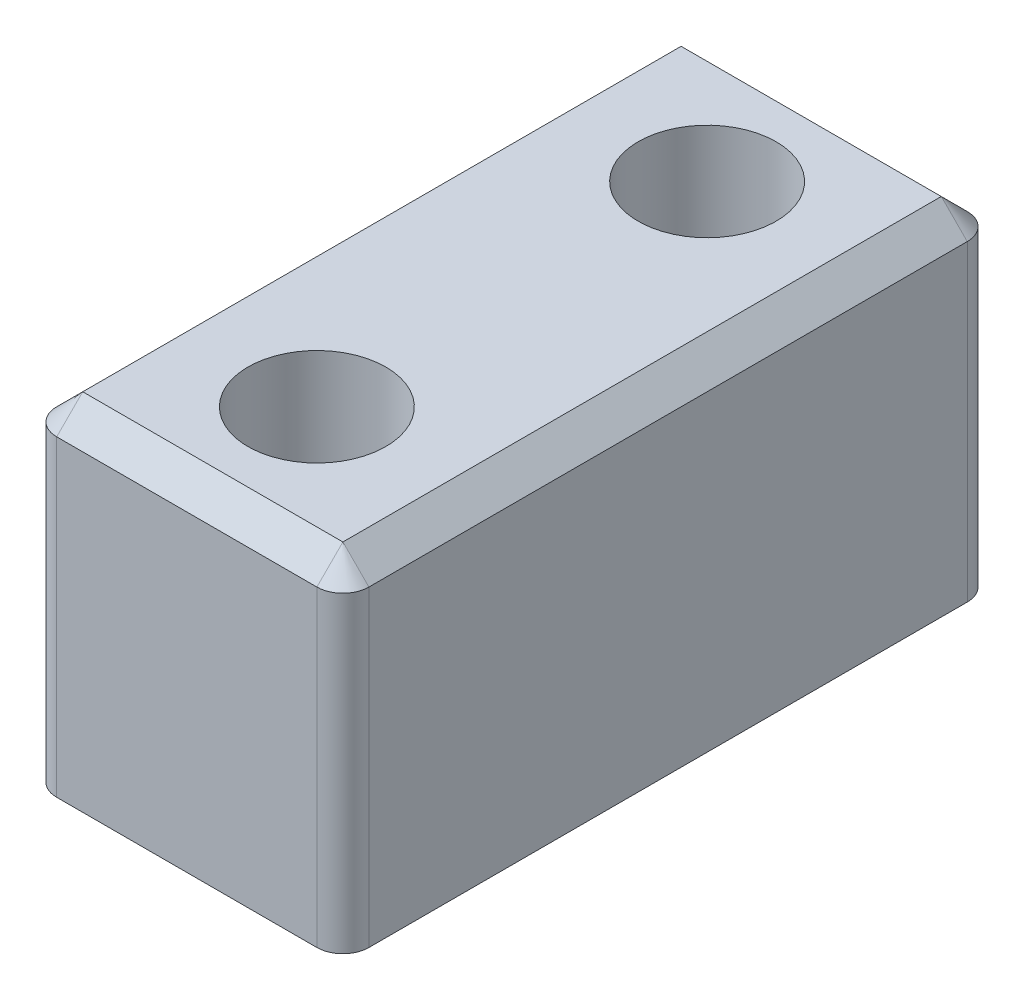
ISO-10303-21;
HEADER;
FILE_DESCRIPTION(('STEP AP214'),'2;1');
FILE_NAME('part.step','',(''),(''),'','','');
FILE_SCHEMA(('AUTOMOTIVE_DESIGN { 1 0 10303 214 1 1 1 1 }'));
ENDSEC;
DATA;
#1=APPLICATION_CONTEXT('core data for automotive mechanical design processes');
#2=APPLICATION_PROTOCOL_DEFINITION('international standard','automotive_design',2000,#1);
#3=PRODUCT_CONTEXT('',#1,'mechanical');
#4=PRODUCT('Part','Part','',(#3));
#5=PRODUCT_RELATED_PRODUCT_CATEGORY('part','',(#4));
#6=PRODUCT_DEFINITION_FORMATION('','',#4);
#7=PRODUCT_DEFINITION_CONTEXT('part definition',#1,'design');
#8=PRODUCT_DEFINITION('design','',#6,#7);
#9=PRODUCT_DEFINITION_SHAPE('','',#8);
#10=(LENGTH_UNIT() NAMED_UNIT(*) SI_UNIT(.MILLI.,.METRE.));
#11=(NAMED_UNIT(*) PLANE_ANGLE_UNIT() SI_UNIT($,.RADIAN.));
#12=(NAMED_UNIT(*) SI_UNIT($,.STERADIAN.) SOLID_ANGLE_UNIT());
#13=UNCERTAINTY_MEASURE_WITH_UNIT(LENGTH_MEASURE(1.E-05),#10,'distance_accuracy_value','');
#14=(GEOMETRIC_REPRESENTATION_CONTEXT(3) GLOBAL_UNCERTAINTY_ASSIGNED_CONTEXT((#13)) GLOBAL_UNIT_ASSIGNED_CONTEXT((#10,
#11,#12)) REPRESENTATION_CONTEXT('',''));
#15=CARTESIAN_POINT('',(0.,0.,0.));
#16=DIRECTION('',(0.,0.,1.));
#17=DIRECTION('',(1.,0.,0.));
#18=AXIS2_PLACEMENT_3D('',#15,#16,#17);
#19=CARTESIAN_POINT('',(0.,6.5,0.));
#20=DIRECTION('',(0.,1.,0.));
#21=DIRECTION('',(0.,0.,1.));
#22=AXIS2_PLACEMENT_3D('',#19,#20,#21);
#23=PLANE('',#22);
#24=DIRECTION('',(0.,0.,-1.));
#25=VECTOR('',#24,1.);
#26=CARTESIAN_POINT('',(5.,6.5,-11.5));
#27=LINE('',#26,#25);
#28=CARTESIAN_POINT('',(5.,6.5,11.5));
#29=VERTEX_POINT('',#28);
#30=CARTESIAN_POINT('',(5.,6.5,-11.5));
#31=VERTEX_POINT('',#30);
#32=EDGE_CURVE('E162',#29,#31,#27,.T.);
#33=ORIENTED_EDGE('',*,*,#32,.T.);
#34=DIRECTION('',(-1.,0.,0.));
#35=VECTOR('',#34,1.);
#36=CARTESIAN_POINT('',(-5.,6.5,-11.5));
#37=LINE('',#36,#35);
#38=CARTESIAN_POINT('',(-5.,6.5,-11.5));
#39=VERTEX_POINT('',#38);
#40=EDGE_CURVE('E166',#31,#39,#37,.T.);
#41=ORIENTED_EDGE('',*,*,#40,.T.);
#42=DIRECTION('',(0.,0.,1.));
#43=VECTOR('',#42,1.);
#44=CARTESIAN_POINT('',(-5.,6.5,11.5));
#45=LINE('',#44,#43);
#46=CARTESIAN_POINT('',(-5.,6.5,11.5));
#47=VERTEX_POINT('',#46);
#48=EDGE_CURVE('E164',#39,#47,#45,.T.);
#49=ORIENTED_EDGE('',*,*,#48,.T.);
#50=DIRECTION('',(1.,0.,0.));
#51=VECTOR('',#50,1.);
#52=CARTESIAN_POINT('',(5.,6.5,11.5));
#53=LINE('',#52,#51);
#54=EDGE_CURVE('E160',#47,#29,#53,.T.);
#55=ORIENTED_EDGE('',*,*,#54,.T.);
#56=EDGE_LOOP('',(#33,#41,#49,#55));
#57=FACE_BOUND('',#56,.T.);
#58=CARTESIAN_POINT('',(0.,6.5,-7.5));
#59=DIRECTION('',(0.,1.,0.));
#60=DIRECTION('',(0.,0.,1.));
#61=AXIS2_PLACEMENT_3D('',#58,#59,#60);
#62=CIRCLE('',#61,2.65);
#63=CARTESIAN_POINT('',(0.,6.5,-10.15));
#64=VERTEX_POINT('',#63);
#65=EDGE_CURVE('E217',#64,#64,#62,.T.);
#66=ORIENTED_EDGE('',*,*,#65,.F.);
#67=EDGE_LOOP('',(#66));
#68=FACE_BOUND('',#67,.T.);
#69=CARTESIAN_POINT('',(0.,6.5,7.5));
#70=DIRECTION('',(0.,1.,0.));
#71=DIRECTION('',(0.,0.,1.));
#72=AXIS2_PLACEMENT_3D('',#69,#70,#71);
#73=CIRCLE('',#72,2.65);
#74=CARTESIAN_POINT('',(0.,6.5,4.85));
#75=VERTEX_POINT('',#74);
#76=EDGE_CURVE('E209',#75,#75,#73,.T.);
#77=ORIENTED_EDGE('',*,*,#76,.F.);
#78=EDGE_LOOP('',(#77));
#79=FACE_BOUND('',#78,.T.);
#80=ADVANCED_FACE('F35',(#57,#68,#79),#23,.T.);
#81=CARTESIAN_POINT('',(0.,-6.5,0.));
#82=DIRECTION('',(0.,1.,0.));
#83=DIRECTION('',(0.,0.,1.));
#84=AXIS2_PLACEMENT_3D('',#81,#82,#83);
#85=PLANE('',#84);
#86=DIRECTION('',(1.,0.,0.));
#87=VECTOR('',#86,1.);
#88=CARTESIAN_POINT('',(-6.,-6.5,12.5));
#89=LINE('',#88,#87);
#90=CARTESIAN_POINT('',(-5.,-6.5,12.5));
#91=VERTEX_POINT('',#90);
#92=CARTESIAN_POINT('',(5.,-6.5,12.5));
#93=VERTEX_POINT('',#92);
#94=EDGE_CURVE('E116',#91,#93,#89,.T.);
#95=ORIENTED_EDGE('',*,*,#94,.F.);
#96=CARTESIAN_POINT('',(-5.,-6.5,11.5));
#97=DIRECTION('',(0.,1.,0.));
#98=DIRECTION('',(0.,0.,1.));
#99=AXIS2_PLACEMENT_3D('',#96,#97,#98);
#100=CIRCLE('',#99,1.);
#101=CARTESIAN_POINT('',(-6.,-6.5,11.5));
#102=VERTEX_POINT('',#101);
#103=EDGE_CURVE('E123',#91,#102,#100,.F.);
#104=ORIENTED_EDGE('',*,*,#103,.T.);
#105=DIRECTION('',(0.,0.,1.));
#106=VECTOR('',#105,1.);
#107=CARTESIAN_POINT('',(-6.,-6.5,-12.5));
#108=LINE('',#107,#106);
#109=CARTESIAN_POINT('',(-6.,-6.5,-11.5));
#110=VERTEX_POINT('',#109);
#111=EDGE_CURVE('E137',#110,#102,#108,.T.);
#112=ORIENTED_EDGE('',*,*,#111,.F.);
#113=CARTESIAN_POINT('',(-5.,-6.5,-11.5));
#114=DIRECTION('',(0.,1.,0.));
#115=DIRECTION('',(0.,0.,1.));
#116=AXIS2_PLACEMENT_3D('',#113,#114,#115);
#117=CIRCLE('',#116,1.);
#118=CARTESIAN_POINT('',(-5.,-6.5,-12.5));
#119=VERTEX_POINT('',#118);
#120=EDGE_CURVE('E131',#110,#119,#117,.F.);
#121=ORIENTED_EDGE('',*,*,#120,.T.);
#122=DIRECTION('',(-1.,0.,0.));
#123=VECTOR('',#122,1.);
#124=CARTESIAN_POINT('',(-6.,-6.5,-12.5));
#125=LINE('',#124,#123);
#126=CARTESIAN_POINT('',(5.,-6.5,-12.5));
#127=VERTEX_POINT('',#126);
#128=EDGE_CURVE('E140',#127,#119,#125,.T.);
#129=ORIENTED_EDGE('',*,*,#128,.F.);
#130=CARTESIAN_POINT('',(5.,-6.5,-11.5));
#131=DIRECTION('',(0.,1.,0.));
#132=DIRECTION('',(0.,0.,1.));
#133=AXIS2_PLACEMENT_3D('',#130,#131,#132);
#134=CIRCLE('',#133,1.);
#135=CARTESIAN_POINT('',(6.,-6.5,-11.5));
#136=VERTEX_POINT('',#135);
#137=EDGE_CURVE('E145',#127,#136,#134,.F.);
#138=ORIENTED_EDGE('',*,*,#137,.T.);
#139=DIRECTION('',(0.,0.,-1.));
#140=VECTOR('',#139,1.);
#141=CARTESIAN_POINT('',(6.,-6.5,-12.5));
#142=LINE('',#141,#140);
#143=CARTESIAN_POINT('',(6.,-6.5,11.5));
#144=VERTEX_POINT('',#143);
#145=EDGE_CURVE('E220',#144,#136,#142,.T.);
#146=ORIENTED_EDGE('',*,*,#145,.F.);
#147=CARTESIAN_POINT('',(5.,-6.5,11.5));
#148=DIRECTION('',(0.,1.,0.));
#149=DIRECTION('',(0.,0.,1.));
#150=AXIS2_PLACEMENT_3D('',#147,#148,#149);
#151=CIRCLE('',#150,1.);
#152=EDGE_CURVE('E119',#144,#93,#151,.F.);
#153=ORIENTED_EDGE('',*,*,#152,.T.);
#154=EDGE_LOOP('',(#95,#104,#112,#121,#129,#138,#146,#153));
#155=FACE_BOUND('',#154,.T.);
#156=CARTESIAN_POINT('',(0.,-6.5,-7.5));
#157=DIRECTION('',(0.,1.,0.));
#158=DIRECTION('',(0.,0.,1.));
#159=AXIS2_PLACEMENT_3D('',#156,#157,#158);
#160=CIRCLE('',#159,2.65);
#161=CARTESIAN_POINT('',(0.,-6.5,-10.15));
#162=VERTEX_POINT('',#161);
#163=EDGE_CURVE('E214',#162,#162,#160,.T.);
#164=ORIENTED_EDGE('',*,*,#163,.T.);
#165=EDGE_LOOP('',(#164));
#166=FACE_BOUND('',#165,.T.);
#167=CARTESIAN_POINT('',(0.,-6.5,7.5));
#168=DIRECTION('',(0.,1.,0.));
#169=DIRECTION('',(0.,0.,1.));
#170=AXIS2_PLACEMENT_3D('',#167,#168,#169);
#171=CIRCLE('',#170,2.65);
#172=CARTESIAN_POINT('',(0.,-6.5,4.85));
#173=VERTEX_POINT('',#172);
#174=EDGE_CURVE('E204',#173,#173,#171,.T.);
#175=ORIENTED_EDGE('',*,*,#174,.T.);
#176=EDGE_LOOP('',(#175));
#177=FACE_BOUND('',#176,.T.);
#178=ADVANCED_FACE('F133',(#155,#166,#177),#85,.F.);
#179=CARTESIAN_POINT('',(6.,6.5,-12.5));
#180=DIRECTION('',(-1.,0.,0.));
#181=DIRECTION('',(0.,0.,1.));
#182=AXIS2_PLACEMENT_3D('',#179,#180,#181);
#183=PLANE('',#182);
#184=DIRECTION('',(0.,-1.,0.));
#185=VECTOR('',#184,1.);
#186=CARTESIAN_POINT('',(6.,6.5,-11.5));
#187=LINE('',#186,#185);
#188=CARTESIAN_POINT('',(6.,5.5,-11.5));
#189=VERTEX_POINT('',#188);
#190=EDGE_CURVE('E157',#136,#189,#187,.F.);
#191=ORIENTED_EDGE('',*,*,#190,.T.);
#192=DIRECTION('',(0.,0.,1.));
#193=VECTOR('',#192,1.);
#194=CARTESIAN_POINT('',(6.,5.5,11.5));
#195=LINE('',#194,#193);
#196=CARTESIAN_POINT('',(6.,5.5,11.5));
#197=VERTEX_POINT('',#196);
#198=EDGE_CURVE('E178',#189,#197,#195,.T.);
#199=ORIENTED_EDGE('',*,*,#198,.T.);
#200=DIRECTION('',(0.,-1.,0.));
#201=VECTOR('',#200,1.);
#202=CARTESIAN_POINT('',(6.,6.5,11.5));
#203=LINE('',#202,#201);
#204=EDGE_CURVE('E155',#197,#144,#203,.T.);
#205=ORIENTED_EDGE('',*,*,#204,.T.);
#206=ORIENTED_EDGE('',*,*,#145,.T.);
#207=EDGE_LOOP('',(#191,#199,#205,#206));
#208=FACE_BOUND('',#207,.T.);
#209=ADVANCED_FACE('F251',(#208),#183,.F.);
#210=CARTESIAN_POINT('',(-6.,6.5,-12.5));
#211=DIRECTION('',(0.,0.,1.));
#212=DIRECTION('',(1.,0.,0.));
#213=AXIS2_PLACEMENT_3D('',#210,#211,#212);
#214=PLANE('',#213);
#215=DIRECTION('',(0.,-1.,0.));
#216=VECTOR('',#215,1.);
#217=CARTESIAN_POINT('',(-5.,6.5,-12.5));
#218=LINE('',#217,#216);
#219=CARTESIAN_POINT('',(-5.,5.5,-12.5));
#220=VERTEX_POINT('',#219);
#221=EDGE_CURVE('E152',#119,#220,#218,.F.);
#222=ORIENTED_EDGE('',*,*,#221,.T.);
#223=DIRECTION('',(1.,0.,0.));
#224=VECTOR('',#223,1.);
#225=CARTESIAN_POINT('',(5.,5.5,-12.5));
#226=LINE('',#225,#224);
#227=CARTESIAN_POINT('',(5.,5.5,-12.5));
#228=VERTEX_POINT('',#227);
#229=EDGE_CURVE('E169',#220,#228,#226,.T.);
#230=ORIENTED_EDGE('',*,*,#229,.T.);
#231=DIRECTION('',(0.,-1.,0.));
#232=VECTOR('',#231,1.);
#233=CARTESIAN_POINT('',(5.,6.5,-12.5));
#234=LINE('',#233,#232);
#235=EDGE_CURVE('E150',#228,#127,#234,.T.);
#236=ORIENTED_EDGE('',*,*,#235,.T.);
#237=ORIENTED_EDGE('',*,*,#128,.T.);
#238=EDGE_LOOP('',(#222,#230,#236,#237));
#239=FACE_BOUND('',#238,.T.);
#240=ADVANCED_FACE('F228',(#239),#214,.F.);
#241=CARTESIAN_POINT('',(-6.,6.5,-12.5));
#242=DIRECTION('',(1.,0.,0.));
#243=DIRECTION('',(0.,0.,-1.));
#244=AXIS2_PLACEMENT_3D('',#241,#242,#243);
#245=PLANE('',#244);
#246=DIRECTION('',(0.,-1.,0.));
#247=VECTOR('',#246,1.);
#248=CARTESIAN_POINT('',(-6.,6.5,11.5));
#249=LINE('',#248,#247);
#250=CARTESIAN_POINT('',(-6.,5.5,11.5));
#251=VERTEX_POINT('',#250);
#252=EDGE_CURVE('E126',#102,#251,#249,.F.);
#253=ORIENTED_EDGE('',*,*,#252,.T.);
#254=DIRECTION('',(0.,0.,-1.));
#255=VECTOR('',#254,1.);
#256=CARTESIAN_POINT('',(-6.,5.5,-11.5));
#257=LINE('',#256,#255);
#258=CARTESIAN_POINT('',(-6.,5.5,-11.5));
#259=VERTEX_POINT('',#258);
#260=EDGE_CURVE('E176',#251,#259,#257,.T.);
#261=ORIENTED_EDGE('',*,*,#260,.T.);
#262=DIRECTION('',(0.,-1.,0.));
#263=VECTOR('',#262,1.);
#264=CARTESIAN_POINT('',(-6.,6.5,-11.5));
#265=LINE('',#264,#263);
#266=EDGE_CURVE('E130',#259,#110,#265,.T.);
#267=ORIENTED_EDGE('',*,*,#266,.T.);
#268=ORIENTED_EDGE('',*,*,#111,.T.);
#269=EDGE_LOOP('',(#253,#261,#267,#268));
#270=FACE_BOUND('',#269,.T.);
#271=ADVANCED_FACE('F259',(#270),#245,.F.);
#272=CARTESIAN_POINT('',(-6.,6.5,12.5));
#273=DIRECTION('',(0.,0.,-1.));
#274=DIRECTION('',(-1.,0.,0.));
#275=AXIS2_PLACEMENT_3D('',#272,#273,#274);
#276=PLANE('',#275);
#277=DIRECTION('',(0.,-1.,0.));
#278=VECTOR('',#277,1.);
#279=CARTESIAN_POINT('',(5.,6.5,12.5));
#280=LINE('',#279,#278);
#281=CARTESIAN_POINT('',(5.,5.5,12.5));
#282=VERTEX_POINT('',#281);
#283=EDGE_CURVE('E120',#93,#282,#280,.F.);
#284=ORIENTED_EDGE('',*,*,#283,.T.);
#285=DIRECTION('',(-1.,0.,0.));
#286=VECTOR('',#285,1.);
#287=CARTESIAN_POINT('',(-5.,5.5,12.5));
#288=LINE('',#287,#286);
#289=CARTESIAN_POINT('',(-5.,5.5,12.5));
#290=VERTEX_POINT('',#289);
#291=EDGE_CURVE('E11',#282,#290,#288,.T.);
#292=ORIENTED_EDGE('',*,*,#291,.T.);
#293=DIRECTION('',(0.,-1.,0.));
#294=VECTOR('',#293,1.);
#295=CARTESIAN_POINT('',(-5.,6.5,12.5));
#296=LINE('',#295,#294);
#297=EDGE_CURVE('E112',#290,#91,#296,.T.);
#298=ORIENTED_EDGE('',*,*,#297,.T.);
#299=ORIENTED_EDGE('',*,*,#94,.T.);
#300=EDGE_LOOP('',(#284,#292,#298,#299));
#301=FACE_BOUND('',#300,.T.);
#302=ADVANCED_FACE('F114',(#301),#276,.F.);
#303=CARTESIAN_POINT('',(0.,6.5,-7.5));
#304=DIRECTION('',(0.,-1.,0.));
#305=DIRECTION('',(0.,0.,-1.));
#306=AXIS2_PLACEMENT_3D('',#303,#304,#305);
#307=CYLINDRICAL_SURFACE('',#306,2.65);
#308=CARTESIAN_POINT('',(0.,6.5,-10.15));
#309=CARTESIAN_POINT('',(0.,6.36458333333333,-10.15));
#310=CARTESIAN_POINT('',(0.,6.22916666666667,-10.15));
#311=CARTESIAN_POINT('',(0.,5.95833333333333,-10.15));
#312=CARTESIAN_POINT('',(0.,5.82291666666667,-10.15));
#313=CARTESIAN_POINT('',(0.,5.55208333333333,-10.15));
#314=CARTESIAN_POINT('',(0.,5.41666666666667,-10.15));
#315=CARTESIAN_POINT('',(0.,5.14583333333333,-10.15));
#316=CARTESIAN_POINT('',(0.,5.01041666666667,-10.15));
#317=CARTESIAN_POINT('',(0.,4.73958333333333,-10.15));
#318=CARTESIAN_POINT('',(0.,4.60416666666667,-10.15));
#319=CARTESIAN_POINT('',(0.,4.33333333333333,-10.15));
#320=CARTESIAN_POINT('',(0.,4.19791666666667,-10.15));
#321=CARTESIAN_POINT('',(0.,3.92708333333333,-10.15));
#322=CARTESIAN_POINT('',(0.,3.79166666666667,-10.15));
#323=CARTESIAN_POINT('',(0.,3.52083333333333,-10.15));
#324=CARTESIAN_POINT('',(0.,3.38541666666667,-10.15));
#325=CARTESIAN_POINT('',(0.,3.11458333333333,-10.15));
#326=CARTESIAN_POINT('',(0.,2.97916666666667,-10.15));
#327=CARTESIAN_POINT('',(0.,2.70833333333333,-10.15));
#328=CARTESIAN_POINT('',(0.,2.57291666666667,-10.15));
#329=CARTESIAN_POINT('',(0.,2.30208333333333,-10.15));
#330=CARTESIAN_POINT('',(0.,2.16666666666667,-10.15));
#331=CARTESIAN_POINT('',(0.,1.89583333333333,-10.15));
#332=CARTESIAN_POINT('',(0.,1.76041666666667,-10.15));
#333=CARTESIAN_POINT('',(0.,1.48958333333333,-10.15));
#334=CARTESIAN_POINT('',(0.,1.35416666666667,-10.15));
#335=CARTESIAN_POINT('',(0.,1.08333333333333,-10.15));
#336=CARTESIAN_POINT('',(0.,0.947916666666666,-10.15));
#337=CARTESIAN_POINT('',(0.,0.677083333333332,-10.15));
#338=CARTESIAN_POINT('',(0.,0.541666666666666,-10.15));
#339=CARTESIAN_POINT('',(0.,0.270833333333333,-10.15));
#340=CARTESIAN_POINT('',(0.,0.135416666666666,-10.15));
#341=CARTESIAN_POINT('',(0.,-0.135416666666668,-10.15));
#342=CARTESIAN_POINT('',(0.,-0.270833333333334,-10.15));
#343=CARTESIAN_POINT('',(0.,-0.541666666666668,-10.15));
#344=CARTESIAN_POINT('',(0.,-0.677083333333334,-10.15));
#345=CARTESIAN_POINT('',(0.,-0.947916666666667,-10.15));
#346=CARTESIAN_POINT('',(0.,-1.08333333333333,-10.15));
#347=CARTESIAN_POINT('',(0.,-1.35416666666667,-10.15));
#348=CARTESIAN_POINT('',(0.,-1.48958333333333,-10.15));
#349=CARTESIAN_POINT('',(0.,-1.76041666666667,-10.15));
#350=CARTESIAN_POINT('',(0.,-1.89583333333333,-10.15));
#351=CARTESIAN_POINT('',(0.,-2.16666666666667,-10.15));
#352=CARTESIAN_POINT('',(0.,-2.30208333333333,-10.15));
#353=CARTESIAN_POINT('',(0.,-2.57291666666667,-10.15));
#354=CARTESIAN_POINT('',(0.,-2.70833333333333,-10.15));
#355=CARTESIAN_POINT('',(0.,-2.97916666666667,-10.15));
#356=CARTESIAN_POINT('',(0.,-3.11458333333333,-10.15));
#357=CARTESIAN_POINT('',(0.,-3.38541666666667,-10.15));
#358=CARTESIAN_POINT('',(0.,-3.52083333333333,-10.15));
#359=CARTESIAN_POINT('',(0.,-3.79166666666667,-10.15));
#360=CARTESIAN_POINT('',(0.,-3.92708333333333,-10.15));
#361=CARTESIAN_POINT('',(0.,-4.19791666666667,-10.15));
#362=CARTESIAN_POINT('',(0.,-4.33333333333333,-10.15));
#363=CARTESIAN_POINT('',(0.,-4.60416666666667,-10.15));
#364=CARTESIAN_POINT('',(0.,-4.73958333333333,-10.15));
#365=CARTESIAN_POINT('',(0.,-5.01041666666667,-10.15));
#366=CARTESIAN_POINT('',(0.,-5.14583333333333,-10.15));
#367=CARTESIAN_POINT('',(0.,-5.41666666666667,-10.15));
#368=CARTESIAN_POINT('',(0.,-5.55208333333333,-10.15));
#369=CARTESIAN_POINT('',(0.,-5.82291666666667,-10.15));
#370=CARTESIAN_POINT('',(0.,-5.95833333333333,-10.15));
#371=CARTESIAN_POINT('',(0.,-6.22916666666667,-10.15));
#372=CARTESIAN_POINT('',(0.,-6.36458333333333,-10.15));
#373=CARTESIAN_POINT('',(0.,-6.5,-10.15));
#374=B_SPLINE_CURVE_WITH_KNOTS('',3,(#308,#309,#310,#311,#312,#313,#314,#315,#316,#317,#318,
#319,#320,#321,#322,#323,#324,#325,#326,#327,#328,#329,#330,#331,#332,#333,#334,#335,#336,#337,
#338,#339,#340,#341,#342,#343,#344,#345,#346,#347,#348,#349,#350,#351,#352,#353,#354,#355,#356,
#357,#358,#359,#360,#361,#362,#363,#364,#365,#366,#367,#368,#369,#370,#371,#372,#373),
.UNSPECIFIED.,.F.,.F.,(4,2,2,2,2,2,2,2,2,2,2,2,2,2,2,2,2,2,2,2,2,2,2,2,2,2,2,2,2,2,2,2,4),(0.,
0.40625,0.8125,1.21875,1.625,2.03125,2.4375,2.84375,3.25,3.65625,4.0625,4.46875,4.875,5.28125,
5.6875,6.09375,6.5,6.90625,7.3125,7.71875,8.125,8.53125,8.9375,9.34375,9.75,10.15625,10.5625,
10.96875,11.375,11.78125,12.1875,12.59375,13.),.UNSPECIFIED.);
#375=EDGE_CURVE('BSEAM286',#64,#162,#374,.T.);
#376=ORIENTED_EDGE('',*,*,#65,.T.);
#377=ORIENTED_EDGE('',*,*,#163,.F.);
#378=ORIENTED_EDGE('',*,*,#375,.T.);
#379=ORIENTED_EDGE('',*,*,#375,.F.);
#380=EDGE_LOOP('',(#376,#378,#377,#379));
#381=FACE_BOUND('',#380,.T.);
#382=ADVANCED_FACE('F286',(#381),#307,.F.);
#383=CARTESIAN_POINT('',(0.,6.5,7.5));
#384=DIRECTION('',(0.,-1.,0.));
#385=DIRECTION('',(0.,0.,-1.));
#386=AXIS2_PLACEMENT_3D('',#383,#384,#385);
#387=CYLINDRICAL_SURFACE('',#386,2.65);
#388=CARTESIAN_POINT('',(0.,6.5,4.85));
#389=CARTESIAN_POINT('',(0.,6.36458333333333,4.85));
#390=CARTESIAN_POINT('',(0.,6.22916666666667,4.85));
#391=CARTESIAN_POINT('',(0.,5.95833333333333,4.85));
#392=CARTESIAN_POINT('',(0.,5.82291666666667,4.85));
#393=CARTESIAN_POINT('',(0.,5.55208333333333,4.85));
#394=CARTESIAN_POINT('',(0.,5.41666666666667,4.85));
#395=CARTESIAN_POINT('',(0.,5.14583333333333,4.85));
#396=CARTESIAN_POINT('',(0.,5.01041666666667,4.85));
#397=CARTESIAN_POINT('',(0.,4.73958333333333,4.85));
#398=CARTESIAN_POINT('',(0.,4.60416666666667,4.85));
#399=CARTESIAN_POINT('',(0.,4.33333333333333,4.85));
#400=CARTESIAN_POINT('',(0.,4.19791666666667,4.85));
#401=CARTESIAN_POINT('',(0.,3.92708333333333,4.85));
#402=CARTESIAN_POINT('',(0.,3.79166666666667,4.85));
#403=CARTESIAN_POINT('',(0.,3.52083333333333,4.85));
#404=CARTESIAN_POINT('',(0.,3.38541666666667,4.85));
#405=CARTESIAN_POINT('',(0.,3.11458333333333,4.85));
#406=CARTESIAN_POINT('',(0.,2.97916666666667,4.85));
#407=CARTESIAN_POINT('',(0.,2.70833333333333,4.85));
#408=CARTESIAN_POINT('',(0.,2.57291666666667,4.85));
#409=CARTESIAN_POINT('',(0.,2.30208333333333,4.85));
#410=CARTESIAN_POINT('',(0.,2.16666666666667,4.85));
#411=CARTESIAN_POINT('',(0.,1.89583333333333,4.85));
#412=CARTESIAN_POINT('',(0.,1.76041666666667,4.85));
#413=CARTESIAN_POINT('',(0.,1.48958333333333,4.85));
#414=CARTESIAN_POINT('',(0.,1.35416666666667,4.85));
#415=CARTESIAN_POINT('',(0.,1.08333333333333,4.85));
#416=CARTESIAN_POINT('',(0.,0.947916666666666,4.85));
#417=CARTESIAN_POINT('',(0.,0.677083333333332,4.85));
#418=CARTESIAN_POINT('',(0.,0.541666666666666,4.85));
#419=CARTESIAN_POINT('',(0.,0.270833333333333,4.85));
#420=CARTESIAN_POINT('',(0.,0.135416666666666,4.85));
#421=CARTESIAN_POINT('',(0.,-0.135416666666668,4.85));
#422=CARTESIAN_POINT('',(0.,-0.270833333333334,4.85));
#423=CARTESIAN_POINT('',(0.,-0.541666666666668,4.85));
#424=CARTESIAN_POINT('',(0.,-0.677083333333334,4.85));
#425=CARTESIAN_POINT('',(0.,-0.947916666666667,4.85));
#426=CARTESIAN_POINT('',(0.,-1.08333333333333,4.85));
#427=CARTESIAN_POINT('',(0.,-1.35416666666667,4.85));
#428=CARTESIAN_POINT('',(0.,-1.48958333333333,4.85));
#429=CARTESIAN_POINT('',(0.,-1.76041666666667,4.85));
#430=CARTESIAN_POINT('',(0.,-1.89583333333333,4.85));
#431=CARTESIAN_POINT('',(0.,-2.16666666666667,4.85));
#432=CARTESIAN_POINT('',(0.,-2.30208333333333,4.85));
#433=CARTESIAN_POINT('',(0.,-2.57291666666667,4.85));
#434=CARTESIAN_POINT('',(0.,-2.70833333333333,4.85));
#435=CARTESIAN_POINT('',(0.,-2.97916666666667,4.85));
#436=CARTESIAN_POINT('',(0.,-3.11458333333333,4.85));
#437=CARTESIAN_POINT('',(0.,-3.38541666666667,4.85));
#438=CARTESIAN_POINT('',(0.,-3.52083333333333,4.85));
#439=CARTESIAN_POINT('',(0.,-3.79166666666667,4.85));
#440=CARTESIAN_POINT('',(0.,-3.92708333333333,4.85));
#441=CARTESIAN_POINT('',(0.,-4.19791666666667,4.85));
#442=CARTESIAN_POINT('',(0.,-4.33333333333333,4.85));
#443=CARTESIAN_POINT('',(0.,-4.60416666666667,4.85));
#444=CARTESIAN_POINT('',(0.,-4.73958333333333,4.85));
#445=CARTESIAN_POINT('',(0.,-5.01041666666667,4.85));
#446=CARTESIAN_POINT('',(0.,-5.14583333333333,4.85));
#447=CARTESIAN_POINT('',(0.,-5.41666666666667,4.85));
#448=CARTESIAN_POINT('',(0.,-5.55208333333333,4.85));
#449=CARTESIAN_POINT('',(0.,-5.82291666666667,4.85));
#450=CARTESIAN_POINT('',(0.,-5.95833333333333,4.85));
#451=CARTESIAN_POINT('',(0.,-6.22916666666667,4.85));
#452=CARTESIAN_POINT('',(0.,-6.36458333333333,4.85));
#453=CARTESIAN_POINT('',(0.,-6.5,4.85));
#454=B_SPLINE_CURVE_WITH_KNOTS('',3,(#388,#389,#390,#391,#392,#393,#394,#395,#396,#397,#398,
#399,#400,#401,#402,#403,#404,#405,#406,#407,#408,#409,#410,#411,#412,#413,#414,#415,#416,#417,
#418,#419,#420,#421,#422,#423,#424,#425,#426,#427,#428,#429,#430,#431,#432,#433,#434,#435,#436,
#437,#438,#439,#440,#441,#442,#443,#444,#445,#446,#447,#448,#449,#450,#451,#452,#453),
.UNSPECIFIED.,.F.,.F.,(4,2,2,2,2,2,2,2,2,2,2,2,2,2,2,2,2,2,2,2,2,2,2,2,2,2,2,2,2,2,2,2,4),(0.,
0.40625,0.8125,1.21875,1.625,2.03125,2.4375,2.84375,3.25,3.65625,4.0625,4.46875,4.875,5.28125,
5.6875,6.09375,6.5,6.90625,7.3125,7.71875,8.125,8.53125,8.9375,9.34375,9.75,10.15625,10.5625,
10.96875,11.375,11.78125,12.1875,12.59375,13.),.UNSPECIFIED.);
#455=EDGE_CURVE('BSEAM299',#75,#173,#454,.T.);
#456=ORIENTED_EDGE('',*,*,#76,.T.);
#457=ORIENTED_EDGE('',*,*,#174,.F.);
#458=ORIENTED_EDGE('',*,*,#455,.T.);
#459=ORIENTED_EDGE('',*,*,#455,.F.);
#460=EDGE_LOOP('',(#456,#458,#457,#459));
#461=FACE_BOUND('',#460,.T.);
#462=ADVANCED_FACE('F299',(#461),#387,.F.);
#463=CARTESIAN_POINT('',(-5.,6.5,11.5));
#464=DIRECTION('',(0.,-1.,0.));
#465=DIRECTION('',(0.,0.,-1.));
#466=AXIS2_PLACEMENT_3D('',#463,#464,#465);
#467=CYLINDRICAL_SURFACE('',#466,1.);
#468=ORIENTED_EDGE('',*,*,#297,.F.);
#469=CARTESIAN_POINT('',(-5.,5.5,11.5));
#470=DIRECTION('',(0.,1.,0.));
#471=DIRECTION('',(0.,0.,1.));
#472=AXIS2_PLACEMENT_3D('',#469,#470,#471);
#473=CIRCLE('',#472,1.);
#474=EDGE_CURVE('E180',#290,#251,#473,.F.);
#475=ORIENTED_EDGE('',*,*,#474,.T.);
#476=ORIENTED_EDGE('',*,*,#252,.F.);
#477=ORIENTED_EDGE('',*,*,#103,.F.);
#478=EDGE_LOOP('',(#468,#475,#476,#477));
#479=FACE_BOUND('',#478,.T.);
#480=ADVANCED_FACE('F124',(#479),#467,.T.);
#481=CARTESIAN_POINT('',(-5.,6.5,-11.5));
#482=DIRECTION('',(0.,-1.,0.));
#483=DIRECTION('',(0.,0.,-1.));
#484=AXIS2_PLACEMENT_3D('',#481,#482,#483);
#485=CYLINDRICAL_SURFACE('',#484,1.);
#486=ORIENTED_EDGE('',*,*,#266,.F.);
#487=CARTESIAN_POINT('',(-5.,5.5,-11.5));
#488=DIRECTION('',(0.,1.,0.));
#489=DIRECTION('',(0.,0.,1.));
#490=AXIS2_PLACEMENT_3D('',#487,#488,#489);
#491=CIRCLE('',#490,1.);
#492=EDGE_CURVE('E172',#259,#220,#491,.F.);
#493=ORIENTED_EDGE('',*,*,#492,.T.);
#494=ORIENTED_EDGE('',*,*,#221,.F.);
#495=ORIENTED_EDGE('',*,*,#120,.F.);
#496=EDGE_LOOP('',(#486,#493,#494,#495));
#497=FACE_BOUND('',#496,.T.);
#498=ADVANCED_FACE('F235',(#497),#485,.T.);
#499=CARTESIAN_POINT('',(5.,6.5,-11.5));
#500=DIRECTION('',(0.,-1.,0.));
#501=DIRECTION('',(0.,0.,-1.));
#502=AXIS2_PLACEMENT_3D('',#499,#500,#501);
#503=CYLINDRICAL_SURFACE('',#502,1.);
#504=ORIENTED_EDGE('',*,*,#235,.F.);
#505=CARTESIAN_POINT('',(5.,5.5,-11.5));
#506=DIRECTION('',(0.,1.,0.));
#507=DIRECTION('',(0.,0.,1.));
#508=AXIS2_PLACEMENT_3D('',#505,#506,#507);
#509=CIRCLE('',#508,1.);
#510=EDGE_CURVE('E174',#228,#189,#509,.F.);
#511=ORIENTED_EDGE('',*,*,#510,.T.);
#512=ORIENTED_EDGE('',*,*,#190,.F.);
#513=ORIENTED_EDGE('',*,*,#137,.F.);
#514=EDGE_LOOP('',(#504,#511,#512,#513));
#515=FACE_BOUND('',#514,.T.);
#516=ADVANCED_FACE('F248',(#515),#503,.T.);
#517=CARTESIAN_POINT('',(5.,6.5,11.5));
#518=DIRECTION('',(0.,-1.,0.));
#519=DIRECTION('',(0.,0.,-1.));
#520=AXIS2_PLACEMENT_3D('',#517,#518,#519);
#521=CYLINDRICAL_SURFACE('',#520,1.);
#522=ORIENTED_EDGE('',*,*,#204,.F.);
#523=CARTESIAN_POINT('',(5.,5.5,11.5));
#524=DIRECTION('',(0.,1.,0.));
#525=DIRECTION('',(0.,0.,1.));
#526=AXIS2_PLACEMENT_3D('',#523,#524,#525);
#527=CIRCLE('',#526,1.);
#528=EDGE_CURVE('E45',#197,#282,#527,.F.);
#529=ORIENTED_EDGE('',*,*,#528,.T.);
#530=ORIENTED_EDGE('',*,*,#283,.F.);
#531=ORIENTED_EDGE('',*,*,#152,.F.);
#532=EDGE_LOOP('',(#522,#529,#530,#531));
#533=FACE_BOUND('',#532,.T.);
#534=ADVANCED_FACE('F253',(#533),#521,.T.);
#535=CARTESIAN_POINT('',(0.,6.5,11.5));
#536=DIRECTION('',(0.,0.707106781186546,0.707106781186549));
#537=DIRECTION('',(-1.,0.,0.));
#538=AXIS2_PLACEMENT_3D('',#535,#536,#537);
#539=PLANE('',#538);
#540=DIRECTION('',(0.,0.707106781186549,-0.707106781186546));
#541=VECTOR('',#540,1.);
#542=CARTESIAN_POINT('',(-5.,5.5,12.5));
#543=LINE('',#542,#541);
#544=EDGE_CURVE('E198',#290,#47,#543,.T.);
#545=ORIENTED_EDGE('',*,*,#544,.F.);
#546=ORIENTED_EDGE('',*,*,#291,.F.);
#547=DIRECTION('',(0.,-0.707106781186549,0.707106781186546));
#548=VECTOR('',#547,1.);
#549=CARTESIAN_POINT('',(5.,6.5,11.5));
#550=LINE('',#549,#548);
#551=EDGE_CURVE('E40',#29,#282,#550,.T.);
#552=ORIENTED_EDGE('',*,*,#551,.F.);
#553=ORIENTED_EDGE('',*,*,#54,.F.);
#554=EDGE_LOOP('',(#545,#546,#552,#553));
#555=FACE_BOUND('',#554,.T.);
#556=ADVANCED_FACE('F38',(#555),#539,.T.);
#557=CARTESIAN_POINT('',(5.,5.5,11.5));
#558=DIRECTION('',(0.,-1.,0.));
#559=DIRECTION('',(0.,0.,-1.));
#560=AXIS2_PLACEMENT_3D('',#557,#558,#559);
#561=CONICAL_SURFACE('',#560,0.999999999999997,0.785398163397447);
#562=ORIENTED_EDGE('',*,*,#551,.T.);
#563=ORIENTED_EDGE('',*,*,#528,.F.);
#564=DIRECTION('',(0.707106781186546,-0.707106781186549,0.));
#565=VECTOR('',#564,1.);
#566=CARTESIAN_POINT('',(5.,6.5,11.5));
#567=LINE('',#566,#565);
#568=EDGE_CURVE('E196',#29,#197,#567,.T.);
#569=ORIENTED_EDGE('',*,*,#568,.F.);
#570=EDGE_LOOP('',(#562,#563,#569));
#571=FACE_BOUND('',#570,.T.);
#572=ADVANCED_FACE('F329',(#571),#561,.T.);
#573=CARTESIAN_POINT('',(-5.,5.5,11.5));
#574=DIRECTION('',(0.,-1.,0.));
#575=DIRECTION('',(0.,0.,-1.));
#576=AXIS2_PLACEMENT_3D('',#573,#574,#575);
#577=CONICAL_SURFACE('',#576,0.999999999999997,0.785398163397447);
#578=ORIENTED_EDGE('',*,*,#474,.F.);
#579=ORIENTED_EDGE('',*,*,#544,.T.);
#580=DIRECTION('',(0.707106781186547,0.707106781186548,0.));
#581=VECTOR('',#580,1.);
#582=CARTESIAN_POINT('',(-6.,5.5,11.5));
#583=LINE('',#582,#581);
#584=EDGE_CURVE('E193',#251,#47,#583,.T.);
#585=ORIENTED_EDGE('',*,*,#584,.F.);
#586=EDGE_LOOP('',(#578,#579,#585));
#587=FACE_BOUND('',#586,.T.);
#588=ADVANCED_FACE('F256',(#587),#577,.T.);
#589=CARTESIAN_POINT('',(5.,6.5,0.));
#590=DIRECTION('',(0.707106781186549,0.707106781186546,0.));
#591=DIRECTION('',(0.,0.,1.));
#592=AXIS2_PLACEMENT_3D('',#589,#590,#591);
#593=PLANE('',#592);
#594=ORIENTED_EDGE('',*,*,#568,.T.);
#595=ORIENTED_EDGE('',*,*,#198,.F.);
#596=DIRECTION('',(0.707106781186546,-0.707106781186549,0.));
#597=VECTOR('',#596,1.);
#598=CARTESIAN_POINT('',(5.,6.5,-11.5));
#599=LINE('',#598,#597);
#600=EDGE_CURVE('E190',#31,#189,#599,.T.);
#601=ORIENTED_EDGE('',*,*,#600,.F.);
#602=ORIENTED_EDGE('',*,*,#32,.F.);
#603=EDGE_LOOP('',(#594,#595,#601,#602));
#604=FACE_BOUND('',#603,.T.);
#605=ADVANCED_FACE('F267',(#604),#593,.T.);
#606=CARTESIAN_POINT('',(-5.,6.5,0.));
#607=DIRECTION('',(-0.707106781186549,0.707106781186546,0.));
#608=DIRECTION('',(0.,0.,-1.));
#609=AXIS2_PLACEMENT_3D('',#606,#607,#608);
#610=PLANE('',#609);
#611=ORIENTED_EDGE('',*,*,#584,.T.);
#612=ORIENTED_EDGE('',*,*,#48,.F.);
#613=DIRECTION('',(0.707106781186546,0.707106781186549,0.));
#614=VECTOR('',#613,1.);
#615=CARTESIAN_POINT('',(-6.,5.5,-11.5));
#616=LINE('',#615,#614);
#617=EDGE_CURVE('E187',#259,#39,#616,.T.);
#618=ORIENTED_EDGE('',*,*,#617,.F.);
#619=ORIENTED_EDGE('',*,*,#260,.F.);
#620=EDGE_LOOP('',(#611,#612,#618,#619));
#621=FACE_BOUND('',#620,.T.);
#622=ADVANCED_FACE('F261',(#621),#610,.T.);
#623=CARTESIAN_POINT('',(5.,5.5,-11.5));
#624=DIRECTION('',(0.,-1.,0.));
#625=DIRECTION('',(0.,0.,-1.));
#626=AXIS2_PLACEMENT_3D('',#623,#624,#625);
#627=CONICAL_SURFACE('',#626,0.999999999999997,0.785398163397447);
#628=ORIENTED_EDGE('',*,*,#600,.T.);
#629=ORIENTED_EDGE('',*,*,#510,.F.);
#630=DIRECTION('',(0.,-0.707106781186549,-0.707106781186546));
#631=VECTOR('',#630,1.);
#632=CARTESIAN_POINT('',(5.,6.5,-11.5));
#633=LINE('',#632,#631);
#634=EDGE_CURVE('E185',#31,#228,#633,.T.);
#635=ORIENTED_EDGE('',*,*,#634,.F.);
#636=EDGE_LOOP('',(#628,#629,#635));
#637=FACE_BOUND('',#636,.T.);
#638=ADVANCED_FACE('F269',(#637),#627,.T.);
#639=CARTESIAN_POINT('',(-5.,5.5,-11.5));
#640=DIRECTION('',(0.,-1.,0.));
#641=DIRECTION('',(0.,0.,-1.));
#642=AXIS2_PLACEMENT_3D('',#639,#640,#641);
#643=CONICAL_SURFACE('',#642,0.999999999999997,0.785398163397447);
#644=ORIENTED_EDGE('',*,*,#492,.F.);
#645=ORIENTED_EDGE('',*,*,#617,.T.);
#646=DIRECTION('',(0.,0.707106781186549,0.707106781186546));
#647=VECTOR('',#646,1.);
#648=CARTESIAN_POINT('',(-5.,5.5,-12.5));
#649=LINE('',#648,#647);
#650=EDGE_CURVE('E183',#220,#39,#649,.T.);
#651=ORIENTED_EDGE('',*,*,#650,.F.);
#652=EDGE_LOOP('',(#644,#645,#651));
#653=FACE_BOUND('',#652,.T.);
#654=ADVANCED_FACE('F240',(#653),#643,.T.);
#655=CARTESIAN_POINT('',(0.,6.5,-11.5));
#656=DIRECTION('',(0.,0.707106781186546,-0.707106781186549));
#657=DIRECTION('',(1.,0.,0.));
#658=AXIS2_PLACEMENT_3D('',#655,#656,#657);
#659=PLANE('',#658);
#660=ORIENTED_EDGE('',*,*,#634,.T.);
#661=ORIENTED_EDGE('',*,*,#229,.F.);
#662=ORIENTED_EDGE('',*,*,#650,.T.);
#663=ORIENTED_EDGE('',*,*,#40,.F.);
#664=EDGE_LOOP('',(#660,#661,#662,#663));
#665=FACE_BOUND('',#664,.T.);
#666=ADVANCED_FACE('F244',(#665),#659,.T.);
#667=CLOSED_SHELL('',(#80,#178,#209,#240,#271,#302,#382,#462,#480,#498,#516,#534,#556,#572,#588,
#605,#622,#638,#654,#666));
#668=MANIFOLD_SOLID_BREP('B2',#667);
#669=ADVANCED_BREP_SHAPE_REPRESENTATION('',(#18,#668),#14);
#670=SHAPE_DEFINITION_REPRESENTATION(#9,#669);
ENDSEC;
END-ISO-10303-21;
